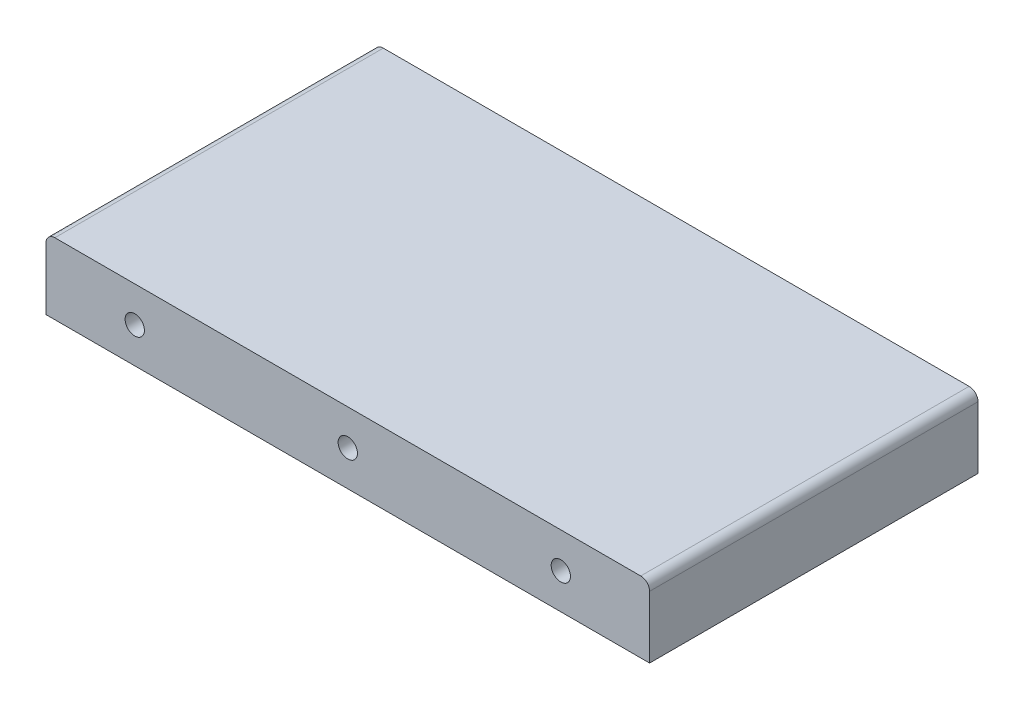
ISO-10303-21;
HEADER;
FILE_DESCRIPTION(('STEP AP214'),'2;1');
FILE_NAME('part.step','',(''),(''),'','','');
FILE_SCHEMA(('AUTOMOTIVE_DESIGN { 1 0 10303 214 1 1 1 1 }'));
ENDSEC;
DATA;
#1=APPLICATION_CONTEXT('core data for automotive mechanical design processes');
#2=APPLICATION_PROTOCOL_DEFINITION('international standard','automotive_design',2000,#1);
#3=PRODUCT_CONTEXT('',#1,'mechanical');
#4=PRODUCT('Part','Part','',(#3));
#5=PRODUCT_RELATED_PRODUCT_CATEGORY('part','',(#4));
#6=PRODUCT_DEFINITION_FORMATION('','',#4);
#7=PRODUCT_DEFINITION_CONTEXT('part definition',#1,'design');
#8=PRODUCT_DEFINITION('design','',#6,#7);
#9=PRODUCT_DEFINITION_SHAPE('','',#8);
#10=(LENGTH_UNIT() NAMED_UNIT(*) SI_UNIT(.MILLI.,.METRE.));
#11=(NAMED_UNIT(*) PLANE_ANGLE_UNIT() SI_UNIT($,.RADIAN.));
#12=(NAMED_UNIT(*) SI_UNIT($,.STERADIAN.) SOLID_ANGLE_UNIT());
#13=UNCERTAINTY_MEASURE_WITH_UNIT(LENGTH_MEASURE(1.E-05),#10,'distance_accuracy_value','');
#14=(GEOMETRIC_REPRESENTATION_CONTEXT(3) GLOBAL_UNCERTAINTY_ASSIGNED_CONTEXT((#13)) GLOBAL_UNIT_ASSIGNED_CONTEXT((#10,
#11,#12)) REPRESENTATION_CONTEXT('',''));
#15=CARTESIAN_POINT('',(0.,0.,0.));
#16=DIRECTION('',(0.,0.,1.));
#17=DIRECTION('',(1.,0.,0.));
#18=AXIS2_PLACEMENT_3D('',#15,#16,#17);
#19=CARTESIAN_POINT('',(53.975,-6.35,29.36875));
#20=DIRECTION('',(-1.,0.,0.));
#21=DIRECTION('',(0.,0.,1.));
#22=AXIS2_PLACEMENT_3D('',#19,#20,#21);
#23=PLANE('',#22);
#24=DIRECTION('',(0.,1.,0.));
#25=VECTOR('',#24,1.);
#26=CARTESIAN_POINT('',(53.975,-6.35,-29.36875));
#27=LINE('',#26,#25);
#28=CARTESIAN_POINT('',(53.975,-6.35,-29.36875));
#29=VERTEX_POINT('',#28);
#30=CARTESIAN_POINT('',(53.975,4.7625,-29.36875));
#31=VERTEX_POINT('',#30);
#32=EDGE_CURVE('E153',#29,#31,#27,.T.);
#33=ORIENTED_EDGE('',*,*,#32,.T.);
#34=DIRECTION('',(0.,0.,-1.));
#35=VECTOR('',#34,1.);
#36=CARTESIAN_POINT('',(53.975,4.7625,29.36875));
#37=LINE('',#36,#35);
#38=CARTESIAN_POINT('',(53.975,4.7625,29.36875));
#39=VERTEX_POINT('',#38);
#40=EDGE_CURVE('E11',#31,#39,#37,.F.);
#41=ORIENTED_EDGE('',*,*,#40,.T.);
#42=DIRECTION('',(0.,1.,0.));
#43=VECTOR('',#42,1.);
#44=CARTESIAN_POINT('',(53.975,-6.35,29.36875));
#45=LINE('',#44,#43);
#46=CARTESIAN_POINT('',(53.975,-6.35,29.36875));
#47=VERTEX_POINT('',#46);
#48=EDGE_CURVE('E154',#47,#39,#45,.T.);
#49=ORIENTED_EDGE('',*,*,#48,.F.);
#50=DIRECTION('',(0.,0.,-1.));
#51=VECTOR('',#50,1.);
#52=CARTESIAN_POINT('',(53.975,-6.35,29.36875));
#53=LINE('',#52,#51);
#54=EDGE_CURVE('E163',#47,#29,#53,.T.);
#55=ORIENTED_EDGE('',*,*,#54,.T.);
#56=EDGE_LOOP('',(#33,#41,#49,#55));
#57=FACE_BOUND('',#56,.T.);
#58=ADVANCED_FACE('F37',(#57),#23,.F.);
#59=CARTESIAN_POINT('',(-53.9749999999999,6.35,29.36875));
#60=DIRECTION('',(0.,-1.,0.));
#61=DIRECTION('',(0.,0.,-1.));
#62=AXIS2_PLACEMENT_3D('',#59,#60,#61);
#63=PLANE('',#62);
#64=DIRECTION('',(-1.,0.,0.));
#65=VECTOR('',#64,1.);
#66=CARTESIAN_POINT('',(-53.9749999999999,6.35,-29.36875));
#67=LINE('',#66,#65);
#68=CARTESIAN_POINT('',(52.3875000000001,6.35,-29.36875));
#69=VERTEX_POINT('',#68);
#70=CARTESIAN_POINT('',(-52.3874999999999,6.35,-29.36875));
#71=VERTEX_POINT('',#70);
#72=EDGE_CURVE('E165',#69,#71,#67,.T.);
#73=ORIENTED_EDGE('',*,*,#72,.T.);
#74=DIRECTION('',(0.,0.,-1.));
#75=VECTOR('',#74,1.);
#76=CARTESIAN_POINT('',(-52.3874999999999,6.35,29.36875));
#77=LINE('',#76,#75);
#78=CARTESIAN_POINT('',(-52.3874999999999,6.35,29.36875));
#79=VERTEX_POINT('',#78);
#80=EDGE_CURVE('E58',#71,#79,#77,.F.);
#81=ORIENTED_EDGE('',*,*,#80,.T.);
#82=DIRECTION('',(-1.,0.,0.));
#83=VECTOR('',#82,1.);
#84=CARTESIAN_POINT('',(-53.9749999999999,6.35,29.36875));
#85=LINE('',#84,#83);
#86=CARTESIAN_POINT('',(52.3875000000001,6.35,29.36875));
#87=VERTEX_POINT('',#86);
#88=EDGE_CURVE('E156',#87,#79,#85,.T.);
#89=ORIENTED_EDGE('',*,*,#88,.F.);
#90=DIRECTION('',(0.,0.,-1.));
#91=VECTOR('',#90,1.);
#92=CARTESIAN_POINT('',(52.3875000000001,6.35,29.36875));
#93=LINE('',#92,#91);
#94=EDGE_CURVE('E182',#87,#69,#93,.T.);
#95=ORIENTED_EDGE('',*,*,#94,.T.);
#96=EDGE_LOOP('',(#73,#81,#89,#95));
#97=FACE_BOUND('',#96,.T.);
#98=ADVANCED_FACE('F203',(#97),#63,.F.);
#99=CARTESIAN_POINT('',(-53.9749999999999,-6.35,29.36875));
#100=DIRECTION('',(1.,0.,0.));
#101=DIRECTION('',(0.,0.,-1.));
#102=AXIS2_PLACEMENT_3D('',#99,#100,#101);
#103=PLANE('',#102);
#104=DIRECTION('',(0.,-1.,0.));
#105=VECTOR('',#104,1.);
#106=CARTESIAN_POINT('',(-53.9749999999999,-6.35,29.36875));
#107=LINE('',#106,#105);
#108=CARTESIAN_POINT('',(-53.9749999999999,4.7625,29.36875));
#109=VERTEX_POINT('',#108);
#110=CARTESIAN_POINT('',(-53.9749999999999,-6.35,29.36875));
#111=VERTEX_POINT('',#110);
#112=EDGE_CURVE('E159',#109,#111,#107,.T.);
#113=ORIENTED_EDGE('',*,*,#112,.F.);
#114=DIRECTION('',(0.,0.,-1.));
#115=VECTOR('',#114,1.);
#116=CARTESIAN_POINT('',(-53.9749999999999,4.7625,29.36875));
#117=LINE('',#116,#115);
#118=CARTESIAN_POINT('',(-53.9749999999999,4.7625,-29.36875));
#119=VERTEX_POINT('',#118);
#120=EDGE_CURVE('E175',#109,#119,#117,.T.);
#121=ORIENTED_EDGE('',*,*,#120,.T.);
#122=DIRECTION('',(0.,-1.,0.));
#123=VECTOR('',#122,1.);
#124=CARTESIAN_POINT('',(-53.9749999999999,-6.35,-29.36875));
#125=LINE('',#124,#123);
#126=CARTESIAN_POINT('',(-53.9749999999999,-6.35,-29.36875));
#127=VERTEX_POINT('',#126);
#128=EDGE_CURVE('E167',#119,#127,#125,.T.);
#129=ORIENTED_EDGE('',*,*,#128,.T.);
#130=DIRECTION('',(0.,0.,-1.));
#131=VECTOR('',#130,1.);
#132=CARTESIAN_POINT('',(-53.9749999999999,-6.35,29.36875));
#133=LINE('',#132,#131);
#134=EDGE_CURVE('E172',#111,#127,#133,.T.);
#135=ORIENTED_EDGE('',*,*,#134,.F.);
#136=EDGE_LOOP('',(#113,#121,#129,#135));
#137=FACE_BOUND('',#136,.T.);
#138=ADVANCED_FACE('F195',(#137),#103,.F.);
#139=CARTESIAN_POINT('',(-53.9749999999999,-6.35,29.36875));
#140=DIRECTION('',(0.,1.,0.));
#141=DIRECTION('',(0.,0.,1.));
#142=AXIS2_PLACEMENT_3D('',#139,#140,#141);
#143=PLANE('',#142);
#144=DIRECTION('',(1.,0.,0.));
#145=VECTOR('',#144,1.);
#146=CARTESIAN_POINT('',(-53.9749999999999,-6.35,-29.36875));
#147=LINE('',#146,#145);
#148=EDGE_CURVE('E157',#127,#29,#147,.T.);
#149=ORIENTED_EDGE('',*,*,#148,.T.);
#150=ORIENTED_EDGE('',*,*,#54,.F.);
#151=DIRECTION('',(1.,0.,0.));
#152=VECTOR('',#151,1.);
#153=CARTESIAN_POINT('',(-53.9749999999999,-6.35,29.36875));
#154=LINE('',#153,#152);
#155=EDGE_CURVE('E161',#111,#47,#154,.T.);
#156=ORIENTED_EDGE('',*,*,#155,.F.);
#157=ORIENTED_EDGE('',*,*,#134,.T.);
#158=EDGE_LOOP('',(#149,#150,#156,#157));
#159=FACE_BOUND('',#158,.T.);
#160=ADVANCED_FACE('F210',(#159),#143,.F.);
#161=CARTESIAN_POINT('',(0.,0.,29.36875));
#162=DIRECTION('',(0.,0.,-1.));
#163=DIRECTION('',(-1.,0.,0.));
#164=AXIS2_PLACEMENT_3D('',#161,#162,#163);
#165=PLANE('',#164);
#166=CARTESIAN_POINT('',(-38.1,0.,29.36875));
#167=DIRECTION('',(0.,0.,1.));
#168=DIRECTION('',(1.,0.,0.));
#169=AXIS2_PLACEMENT_3D('',#166,#167,#168);
#170=CIRCLE('',#169,1.72719999999999);
#171=CARTESIAN_POINT('',(-36.3728,0.,29.36875));
#172=VERTEX_POINT('',#171);
#173=EDGE_CURVE('E135',#172,#172,#170,.T.);
#174=ORIENTED_EDGE('',*,*,#173,.F.);
#175=EDGE_LOOP('',(#174));
#176=FACE_BOUND('',#175,.T.);
#177=CARTESIAN_POINT('',(38.1,0.,29.36875));
#178=DIRECTION('',(0.,0.,1.));
#179=DIRECTION('',(1.,0.,0.));
#180=AXIS2_PLACEMENT_3D('',#177,#178,#179);
#181=CIRCLE('',#180,1.72719999999999);
#182=CARTESIAN_POINT('',(39.8272,0.,29.36875));
#183=VERTEX_POINT('',#182);
#184=EDGE_CURVE('E141',#183,#183,#181,.T.);
#185=ORIENTED_EDGE('',*,*,#184,.F.);
#186=EDGE_LOOP('',(#185));
#187=FACE_BOUND('',#186,.T.);
#188=CARTESIAN_POINT('',(0.,0.,29.36875));
#189=DIRECTION('',(0.,0.,1.));
#190=DIRECTION('',(1.,0.,0.));
#191=AXIS2_PLACEMENT_3D('',#188,#189,#190);
#192=CIRCLE('',#191,1.72719999999999);
#193=CARTESIAN_POINT('',(1.72719999999999,0.,29.36875));
#194=VERTEX_POINT('',#193);
#195=EDGE_CURVE('E147',#194,#194,#192,.T.);
#196=ORIENTED_EDGE('',*,*,#195,.F.);
#197=EDGE_LOOP('',(#196));
#198=FACE_BOUND('',#197,.T.);
#199=ORIENTED_EDGE('',*,*,#88,.T.);
#200=CARTESIAN_POINT('',(-52.3874999999999,4.7625,29.36875));
#201=DIRECTION('',(0.,0.,-1.));
#202=DIRECTION('',(-1.,0.,0.));
#203=AXIS2_PLACEMENT_3D('',#200,#201,#202);
#204=CIRCLE('',#203,1.5875);
#205=EDGE_CURVE('E45',#79,#109,#204,.F.);
#206=ORIENTED_EDGE('',*,*,#205,.T.);
#207=ORIENTED_EDGE('',*,*,#112,.T.);
#208=ORIENTED_EDGE('',*,*,#155,.T.);
#209=ORIENTED_EDGE('',*,*,#48,.T.);
#210=CARTESIAN_POINT('',(52.3875000000001,4.7625,29.36875));
#211=DIRECTION('',(0.,0.,-1.));
#212=DIRECTION('',(-1.,0.,0.));
#213=AXIS2_PLACEMENT_3D('',#210,#211,#212);
#214=CIRCLE('',#213,1.5875);
#215=EDGE_CURVE('E186',#39,#87,#214,.F.);
#216=ORIENTED_EDGE('',*,*,#215,.T.);
#217=EDGE_LOOP('',(#199,#206,#207,#208,#209,#216));
#218=FACE_BOUND('',#217,.T.);
#219=ADVANCED_FACE('F190',(#176,#187,#198,#218),#165,.F.);
#220=CARTESIAN_POINT('',(0.,0.,-29.36875));
#221=DIRECTION('',(0.,0.,-1.));
#222=DIRECTION('',(-1.,0.,0.));
#223=AXIS2_PLACEMENT_3D('',#220,#221,#222);
#224=PLANE('',#223);
#225=CARTESIAN_POINT('',(-38.1,0.,-29.36875));
#226=DIRECTION('',(0.,0.,-1.));
#227=DIRECTION('',(-1.,0.,0.));
#228=AXIS2_PLACEMENT_3D('',#225,#226,#227);
#229=CIRCLE('',#228,1.72719999999999);
#230=CARTESIAN_POINT('',(-39.8272,0.,-29.36875));
#231=VERTEX_POINT('',#230);
#232=EDGE_CURVE('E119',#231,#231,#229,.T.);
#233=ORIENTED_EDGE('',*,*,#232,.F.);
#234=EDGE_LOOP('',(#233));
#235=FACE_BOUND('',#234,.T.);
#236=CARTESIAN_POINT('',(38.1,0.,-29.36875));
#237=DIRECTION('',(0.,0.,-1.));
#238=DIRECTION('',(-1.,0.,0.));
#239=AXIS2_PLACEMENT_3D('',#236,#237,#238);
#240=CIRCLE('',#239,1.72719999999999);
#241=CARTESIAN_POINT('',(36.3728,0.,-29.36875));
#242=VERTEX_POINT('',#241);
#243=EDGE_CURVE('E118',#242,#242,#240,.T.);
#244=ORIENTED_EDGE('',*,*,#243,.F.);
#245=EDGE_LOOP('',(#244));
#246=FACE_BOUND('',#245,.T.);
#247=CARTESIAN_POINT('',(0.,0.,-29.36875));
#248=DIRECTION('',(0.,0.,-1.));
#249=DIRECTION('',(-1.,0.,0.));
#250=AXIS2_PLACEMENT_3D('',#247,#248,#249);
#251=CIRCLE('',#250,1.72719999999999);
#252=CARTESIAN_POINT('',(-1.72719999999999,0.,-29.36875));
#253=VERTEX_POINT('',#252);
#254=EDGE_CURVE('E129',#253,#253,#251,.T.);
#255=ORIENTED_EDGE('',*,*,#254,.F.);
#256=EDGE_LOOP('',(#255));
#257=FACE_BOUND('',#256,.T.);
#258=ORIENTED_EDGE('',*,*,#128,.F.);
#259=CARTESIAN_POINT('',(-52.3874999999999,4.7625,-29.36875));
#260=DIRECTION('',(0.,0.,-1.));
#261=DIRECTION('',(-1.,0.,0.));
#262=AXIS2_PLACEMENT_3D('',#259,#260,#261);
#263=CIRCLE('',#262,1.5875);
#264=EDGE_CURVE('E180',#119,#71,#263,.T.);
#265=ORIENTED_EDGE('',*,*,#264,.T.);
#266=ORIENTED_EDGE('',*,*,#72,.F.);
#267=CARTESIAN_POINT('',(52.3875000000001,4.7625,-29.36875));
#268=DIRECTION('',(0.,0.,-1.));
#269=DIRECTION('',(-1.,0.,0.));
#270=AXIS2_PLACEMENT_3D('',#267,#268,#269);
#271=CIRCLE('',#270,1.5875);
#272=EDGE_CURVE('E178',#69,#31,#271,.T.);
#273=ORIENTED_EDGE('',*,*,#272,.T.);
#274=ORIENTED_EDGE('',*,*,#32,.F.);
#275=ORIENTED_EDGE('',*,*,#148,.F.);
#276=EDGE_LOOP('',(#258,#265,#266,#273,#274,#275));
#277=FACE_BOUND('',#276,.T.);
#278=ADVANCED_FACE('F201',(#235,#246,#257,#277),#224,.T.);
#279=CARTESIAN_POINT('',(0.,0.,10.31875));
#280=DIRECTION('',(0.,0.,1.));
#281=DIRECTION('',(1.,0.,0.));
#282=AXIS2_PLACEMENT_3D('',#279,#280,#281);
#283=CONICAL_SURFACE('',#282,1.72719999999999,1.02974425867665);
#284=CARTESIAN_POINT('',(0.,0.,9.2809435388156));
#285=VERTEX_POINT('',#284);
#286=VERTEX_LOOP('',#285);
#287=FACE_BOUND('',#286,.T.);
#288=CARTESIAN_POINT('',(0.,0.,10.31875));
#289=DIRECTION('',(0.,0.,1.));
#290=DIRECTION('',(1.,0.,0.));
#291=AXIS2_PLACEMENT_3D('',#288,#289,#290);
#292=CIRCLE('',#291,1.72719999999999);
#293=CARTESIAN_POINT('',(1.72719999999999,0.,10.31875));
#294=VERTEX_POINT('',#293);
#295=EDGE_CURVE('E150',#294,#294,#292,.T.);
#296=ORIENTED_EDGE('',*,*,#295,.T.);
#297=EDGE_LOOP('',(#296));
#298=FACE_BOUND('',#297,.T.);
#299=ADVANCED_FACE('F271',(#287,#298),#283,.F.);
#300=CARTESIAN_POINT('',(0.,0.,29.36875));
#301=DIRECTION('',(0.,0.,1.));
#302=DIRECTION('',(1.,0.,0.));
#303=AXIS2_PLACEMENT_3D('',#300,#301,#302);
#304=CYLINDRICAL_SURFACE('',#303,1.72719999999999);
#305=ORIENTED_EDGE('',*,*,#295,.F.);
#306=EDGE_LOOP('',(#305));
#307=FACE_BOUND('',#306,.T.);
#308=ORIENTED_EDGE('',*,*,#195,.T.);
#309=EDGE_LOOP('',(#308));
#310=FACE_BOUND('',#309,.T.);
#311=ADVANCED_FACE('F267',(#307,#310),#304,.F.);
#312=CARTESIAN_POINT('',(38.1,0.,10.31875));
#313=DIRECTION('',(0.,0.,1.));
#314=DIRECTION('',(1.,0.,0.));
#315=AXIS2_PLACEMENT_3D('',#312,#313,#314);
#316=CONICAL_SURFACE('',#315,1.72719999999999,1.02974425867665);
#317=CARTESIAN_POINT('',(38.1,0.,9.2809435388156));
#318=VERTEX_POINT('',#317);
#319=VERTEX_LOOP('',#318);
#320=FACE_BOUND('',#319,.T.);
#321=CARTESIAN_POINT('',(38.1,0.,10.31875));
#322=DIRECTION('',(0.,0.,1.));
#323=DIRECTION('',(1.,0.,0.));
#324=AXIS2_PLACEMENT_3D('',#321,#322,#323);
#325=CIRCLE('',#324,1.72719999999999);
#326=CARTESIAN_POINT('',(39.8272,0.,10.31875));
#327=VERTEX_POINT('',#326);
#328=EDGE_CURVE('E144',#327,#327,#325,.T.);
#329=ORIENTED_EDGE('',*,*,#328,.T.);
#330=EDGE_LOOP('',(#329));
#331=FACE_BOUND('',#330,.T.);
#332=ADVANCED_FACE('F263',(#320,#331),#316,.F.);
#333=CARTESIAN_POINT('',(38.1,0.,29.36875));
#334=DIRECTION('',(0.,0.,1.));
#335=DIRECTION('',(1.,0.,0.));
#336=AXIS2_PLACEMENT_3D('',#333,#334,#335);
#337=CYLINDRICAL_SURFACE('',#336,1.72719999999999);
#338=ORIENTED_EDGE('',*,*,#328,.F.);
#339=EDGE_LOOP('',(#338));
#340=FACE_BOUND('',#339,.T.);
#341=ORIENTED_EDGE('',*,*,#184,.T.);
#342=EDGE_LOOP('',(#341));
#343=FACE_BOUND('',#342,.T.);
#344=ADVANCED_FACE('F259',(#340,#343),#337,.F.);
#345=CARTESIAN_POINT('',(-38.1,0.,10.31875));
#346=DIRECTION('',(0.,0.,1.));
#347=DIRECTION('',(1.,0.,0.));
#348=AXIS2_PLACEMENT_3D('',#345,#346,#347);
#349=CONICAL_SURFACE('',#348,1.72719999999999,1.02974425867665);
#350=CARTESIAN_POINT('',(-38.1,0.,9.2809435388156));
#351=VERTEX_POINT('',#350);
#352=VERTEX_LOOP('',#351);
#353=FACE_BOUND('',#352,.T.);
#354=CARTESIAN_POINT('',(-38.1,0.,10.31875));
#355=DIRECTION('',(0.,0.,1.));
#356=DIRECTION('',(1.,0.,0.));
#357=AXIS2_PLACEMENT_3D('',#354,#355,#356);
#358=CIRCLE('',#357,1.72719999999999);
#359=CARTESIAN_POINT('',(-36.3728,0.,10.31875));
#360=VERTEX_POINT('',#359);
#361=EDGE_CURVE('E138',#360,#360,#358,.T.);
#362=ORIENTED_EDGE('',*,*,#361,.T.);
#363=EDGE_LOOP('',(#362));
#364=FACE_BOUND('',#363,.T.);
#365=ADVANCED_FACE('F255',(#353,#364),#349,.F.);
#366=CARTESIAN_POINT('',(-38.1,0.,29.36875));
#367=DIRECTION('',(0.,0.,1.));
#368=DIRECTION('',(1.,0.,0.));
#369=AXIS2_PLACEMENT_3D('',#366,#367,#368);
#370=CYLINDRICAL_SURFACE('',#369,1.72719999999999);
#371=ORIENTED_EDGE('',*,*,#361,.F.);
#372=EDGE_LOOP('',(#371));
#373=FACE_BOUND('',#372,.T.);
#374=ORIENTED_EDGE('',*,*,#173,.T.);
#375=EDGE_LOOP('',(#374));
#376=FACE_BOUND('',#375,.T.);
#377=ADVANCED_FACE('F251',(#373,#376),#370,.F.);
#378=CARTESIAN_POINT('',(0.,0.,-10.31875));
#379=DIRECTION('',(0.,0.,-1.));
#380=DIRECTION('',(-1.,0.,0.));
#381=AXIS2_PLACEMENT_3D('',#378,#379,#380);
#382=CONICAL_SURFACE('',#381,1.72719999999999,1.02974425867665);
#383=CARTESIAN_POINT('',(0.,0.,-9.2809435388156));
#384=VERTEX_POINT('',#383);
#385=VERTEX_LOOP('',#384);
#386=FACE_BOUND('',#385,.T.);
#387=CARTESIAN_POINT('',(0.,0.,-10.31875));
#388=DIRECTION('',(0.,0.,-1.));
#389=DIRECTION('',(-1.,0.,0.));
#390=AXIS2_PLACEMENT_3D('',#387,#388,#389);
#391=CIRCLE('',#390,1.72719999999999);
#392=CARTESIAN_POINT('',(-1.72719999999999,0.,-10.31875));
#393=VERTEX_POINT('',#392);
#394=EDGE_CURVE('E132',#393,#393,#391,.T.);
#395=ORIENTED_EDGE('',*,*,#394,.T.);
#396=EDGE_LOOP('',(#395));
#397=FACE_BOUND('',#396,.T.);
#398=ADVANCED_FACE('F247',(#386,#397),#382,.F.);
#399=CARTESIAN_POINT('',(0.,0.,-29.36875));
#400=DIRECTION('',(0.,0.,-1.));
#401=DIRECTION('',(-1.,0.,0.));
#402=AXIS2_PLACEMENT_3D('',#399,#400,#401);
#403=CYLINDRICAL_SURFACE('',#402,1.72719999999999);
#404=ORIENTED_EDGE('',*,*,#394,.F.);
#405=EDGE_LOOP('',(#404));
#406=FACE_BOUND('',#405,.T.);
#407=ORIENTED_EDGE('',*,*,#254,.T.);
#408=EDGE_LOOP('',(#407));
#409=FACE_BOUND('',#408,.T.);
#410=ADVANCED_FACE('F243',(#406,#409),#403,.F.);
#411=CARTESIAN_POINT('',(38.1,0.,-10.31875));
#412=DIRECTION('',(0.,0.,-1.));
#413=DIRECTION('',(-1.,0.,0.));
#414=AXIS2_PLACEMENT_3D('',#411,#412,#413);
#415=CONICAL_SURFACE('',#414,1.72719999999999,1.02974425867665);
#416=CARTESIAN_POINT('',(38.1,0.,-9.2809435388156));
#417=VERTEX_POINT('',#416);
#418=VERTEX_LOOP('',#417);
#419=FACE_BOUND('',#418,.T.);
#420=CARTESIAN_POINT('',(38.1,0.,-10.31875));
#421=DIRECTION('',(0.,0.,-1.));
#422=DIRECTION('',(-1.,0.,0.));
#423=AXIS2_PLACEMENT_3D('',#420,#421,#422);
#424=CIRCLE('',#423,1.72719999999999);
#425=CARTESIAN_POINT('',(36.3728,0.,-10.31875));
#426=VERTEX_POINT('',#425);
#427=EDGE_CURVE('E122',#426,#426,#424,.T.);
#428=ORIENTED_EDGE('',*,*,#427,.T.);
#429=EDGE_LOOP('',(#428));
#430=FACE_BOUND('',#429,.T.);
#431=ADVANCED_FACE('F239',(#419,#430),#415,.F.);
#432=CARTESIAN_POINT('',(38.1,0.,-29.36875));
#433=DIRECTION('',(0.,0.,-1.));
#434=DIRECTION('',(-1.,0.,0.));
#435=AXIS2_PLACEMENT_3D('',#432,#433,#434);
#436=CYLINDRICAL_SURFACE('',#435,1.72719999999999);
#437=ORIENTED_EDGE('',*,*,#427,.F.);
#438=EDGE_LOOP('',(#437));
#439=FACE_BOUND('',#438,.T.);
#440=ORIENTED_EDGE('',*,*,#243,.T.);
#441=EDGE_LOOP('',(#440));
#442=FACE_BOUND('',#441,.T.);
#443=ADVANCED_FACE('F112',(#439,#442),#436,.F.);
#444=CARTESIAN_POINT('',(-38.1,0.,-10.31875));
#445=DIRECTION('',(0.,0.,-1.));
#446=DIRECTION('',(-1.,0.,0.));
#447=AXIS2_PLACEMENT_3D('',#444,#445,#446);
#448=CONICAL_SURFACE('',#447,1.72719999999999,1.02974425867665);
#449=CARTESIAN_POINT('',(-38.1,0.,-9.2809435388156));
#450=VERTEX_POINT('',#449);
#451=VERTEX_LOOP('',#450);
#452=FACE_BOUND('',#451,.T.);
#453=CARTESIAN_POINT('',(-38.1,0.,-10.31875));
#454=DIRECTION('',(0.,0.,-1.));
#455=DIRECTION('',(-1.,0.,0.));
#456=AXIS2_PLACEMENT_3D('',#453,#454,#455);
#457=CIRCLE('',#456,1.72719999999999);
#458=CARTESIAN_POINT('',(-39.8272,0.,-10.31875));
#459=VERTEX_POINT('',#458);
#460=EDGE_CURVE('E116',#459,#459,#457,.T.);
#461=ORIENTED_EDGE('',*,*,#460,.T.);
#462=EDGE_LOOP('',(#461));
#463=FACE_BOUND('',#462,.T.);
#464=ADVANCED_FACE('F108',(#452,#463),#448,.F.);
#465=CARTESIAN_POINT('',(-38.1,0.,-29.36875));
#466=DIRECTION('',(0.,0.,-1.));
#467=DIRECTION('',(-1.,0.,0.));
#468=AXIS2_PLACEMENT_3D('',#465,#466,#467);
#469=CYLINDRICAL_SURFACE('',#468,1.72719999999999);
#470=ORIENTED_EDGE('',*,*,#460,.F.);
#471=EDGE_LOOP('',(#470));
#472=FACE_BOUND('',#471,.T.);
#473=ORIENTED_EDGE('',*,*,#232,.T.);
#474=EDGE_LOOP('',(#473));
#475=FACE_BOUND('',#474,.T.);
#476=ADVANCED_FACE('F111',(#472,#475),#469,.F.);
#477=CARTESIAN_POINT('',(-52.3874999999999,4.7625,29.36875));
#478=DIRECTION('',(0.,0.,-1.));
#479=DIRECTION('',(-1.,0.,0.));
#480=AXIS2_PLACEMENT_3D('',#477,#478,#479);
#481=CYLINDRICAL_SURFACE('',#480,1.5875);
#482=ORIENTED_EDGE('',*,*,#205,.F.);
#483=ORIENTED_EDGE('',*,*,#80,.F.);
#484=ORIENTED_EDGE('',*,*,#264,.F.);
#485=ORIENTED_EDGE('',*,*,#120,.F.);
#486=EDGE_LOOP('',(#482,#483,#484,#485));
#487=FACE_BOUND('',#486,.T.);
#488=ADVANCED_FACE('F198',(#487),#481,.T.);
#489=CARTESIAN_POINT('',(52.3875000000001,4.7625,29.36875));
#490=DIRECTION('',(0.,0.,-1.));
#491=DIRECTION('',(-1.,0.,0.));
#492=AXIS2_PLACEMENT_3D('',#489,#490,#491);
#493=CYLINDRICAL_SURFACE('',#492,1.5875);
#494=ORIENTED_EDGE('',*,*,#215,.F.);
#495=ORIENTED_EDGE('',*,*,#40,.F.);
#496=ORIENTED_EDGE('',*,*,#272,.F.);
#497=ORIENTED_EDGE('',*,*,#94,.F.);
#498=EDGE_LOOP('',(#494,#495,#496,#497));
#499=FACE_BOUND('',#498,.T.);
#500=ADVANCED_FACE('F39',(#499),#493,.T.);
#501=CLOSED_SHELL('',(#58,#98,#138,#160,#219,#278,#299,#311,#332,#344,#365,#377,#398,#410,#431,
#443,#464,#476,#488,#500));
#502=MANIFOLD_SOLID_BREP('B2',#501);
#503=ADVANCED_BREP_SHAPE_REPRESENTATION('',(#18,#502),#14);
#504=SHAPE_DEFINITION_REPRESENTATION(#9,#503);
ENDSEC;
END-ISO-10303-21;
